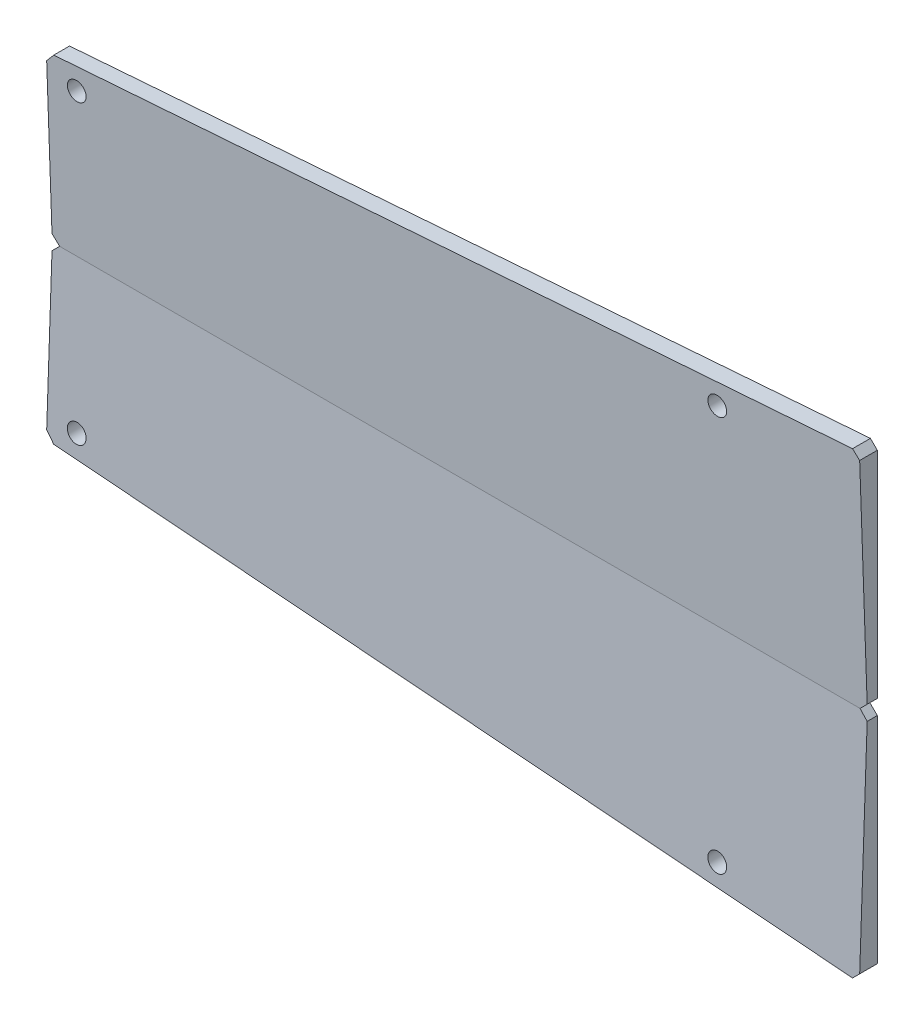
ISO-10303-21;
HEADER;
FILE_DESCRIPTION(('STEP AP214'),'2;1');
FILE_NAME('part.step','',(''),(''),'','','');
FILE_SCHEMA(('AUTOMOTIVE_DESIGN { 1 0 10303 214 1 1 1 1 }'));
ENDSEC;
DATA;
#1=APPLICATION_CONTEXT('core data for automotive mechanical design processes');
#2=APPLICATION_PROTOCOL_DEFINITION('international standard','automotive_design',2000,#1);
#3=PRODUCT_CONTEXT('',#1,'mechanical');
#4=PRODUCT('Part','Part','',(#3));
#5=PRODUCT_RELATED_PRODUCT_CATEGORY('part','',(#4));
#6=PRODUCT_DEFINITION_FORMATION('','',#4);
#7=PRODUCT_DEFINITION_CONTEXT('part definition',#1,'design');
#8=PRODUCT_DEFINITION('design','',#6,#7);
#9=PRODUCT_DEFINITION_SHAPE('','',#8);
#10=(LENGTH_UNIT() NAMED_UNIT(*) SI_UNIT(.MILLI.,.METRE.));
#11=(NAMED_UNIT(*) PLANE_ANGLE_UNIT() SI_UNIT($,.RADIAN.));
#12=(NAMED_UNIT(*) SI_UNIT($,.STERADIAN.) SOLID_ANGLE_UNIT());
#13=UNCERTAINTY_MEASURE_WITH_UNIT(LENGTH_MEASURE(1.E-05),#10,'distance_accuracy_value','');
#14=(GEOMETRIC_REPRESENTATION_CONTEXT(3) GLOBAL_UNCERTAINTY_ASSIGNED_CONTEXT((#13)) GLOBAL_UNIT_ASSIGNED_CONTEXT((#10,
#11,#12)) REPRESENTATION_CONTEXT('',''));
#15=CARTESIAN_POINT('',(0.,0.,0.));
#16=DIRECTION('',(0.,0.,1.));
#17=DIRECTION('',(1.,0.,0.));
#18=AXIS2_PLACEMENT_3D('',#15,#16,#17);
#19=CARTESIAN_POINT('',(-49.4388888888889,0.,2.));
#20=DIRECTION('',(0.,-0.034899496702501,0.999390827019096));
#21=DIRECTION('',(0.,-0.999390827019096,-0.034899496702501));
#22=AXIS2_PLACEMENT_3D('',#19,#20,#21);
#23=PLANE('',#22);
#24=CARTESIAN_POINT('',(86.5611111111111,40.,3.39683077966991));
#25=DIRECTION('',(0.,-0.034899496702501,0.999390827019096));
#26=DIRECTION('',(0.,-0.999390827019096,-0.034899496702501));
#27=AXIS2_PLACEMENT_3D('',#24,#25,#26);
#28=ELLIPSE('',#27,1.90115813416776,1.9);
#29=CARTESIAN_POINT('',(86.5611111111111,38.1,3.33048131763559));
#30=VERTEX_POINT('',#29);
#31=EDGE_CURVE('E204',#30,#30,#28,.T.);
#32=ORIENTED_EDGE('',*,*,#31,.F.);
#33=EDGE_LOOP('',(#32));
#34=FACE_BOUND('',#33,.T.);
#35=DIRECTION('',(-0.997139218587703,-0.0755408498930078,-0.00263794460632445));
#36=VECTOR('',#35,1.);
#37=CARTESIAN_POINT('',(115.556839829289,46.4996764180438,3.62380448163537));
#38=LINE('',#37,#36);
#39=CARTESIAN_POINT('',(114.166744913928,46.3943661971831,3.62012696768757));
#40=VERTEX_POINT('',#39);
#41=CARTESIAN_POINT('',(-47.943174856847,34.1133116690941,3.19126309339658));
#42=VERTEX_POINT('',#41);
#43=EDGE_CURVE('E216',#40,#42,#38,.T.);
#44=ORIENTED_EDGE('',*,*,#43,.T.);
#45=DIRECTION('',(0.651442242059262,0.758236052232911,0.0264781864003583));
#46=VECTOR('',#45,1.);
#47=CARTESIAN_POINT('',(-65.4486373408401,13.7381012369054,2.47974506654827));
#48=LINE('',#47,#46);
#49=CARTESIAN_POINT('',(-49.4388888888889,32.372398615406,3.13046906994357));
#50=VERTEX_POINT('',#49);
#51=EDGE_CURVE('E11',#42,#50,#48,.F.);
#52=ORIENTED_EDGE('',*,*,#51,.T.);
#53=DIRECTION('',(0.,-0.999390827019096,-0.034899496702501));
#54=VECTOR('',#53,1.);
#55=CARTESIAN_POINT('',(-49.4388888888889,33.958588854417,3.18586005365013));
#56=LINE('',#55,#54);
#57=CARTESIAN_POINT('',(-49.4388888888889,1.50000000000002,2.05238115423762));
#58=VERTEX_POINT('',#57);
#59=EDGE_CURVE('E211',#50,#58,#56,.T.);
#60=ORIENTED_EDGE('',*,*,#59,.T.);
#61=DIRECTION('',(-0.706891307583164,0.706891307583164,0.0246851884078319));
#62=VECTOR('',#61,1.);
#63=CARTESIAN_POINT('',(-48.6884318699938,0.74954298110496,2.02617461766732));
#64=LINE('',#63,#62);
#65=CARTESIAN_POINT('',(-47.9388888888889,0.,2.));
#66=VERTEX_POINT('',#65);
#67=EDGE_CURVE('E245',#58,#66,#64,.F.);
#68=ORIENTED_EDGE('',*,*,#67,.T.);
#69=DIRECTION('',(1.,0.,0.));
#70=VECTOR('',#69,1.);
#71=CARTESIAN_POINT('',(-49.4388888888889,0.,2.));
#72=LINE('',#71,#70);
#73=CARTESIAN_POINT('',(114.061111111111,0.,2.));
#74=VERTEX_POINT('',#73);
#75=EDGE_CURVE('E267',#66,#74,#72,.T.);
#76=ORIENTED_EDGE('',*,*,#75,.T.);
#77=DIRECTION('',(-0.706891307583167,-0.70689130758316,-0.0246851884078317));
#78=VECTOR('',#77,1.);
#79=CARTESIAN_POINT('',(32.3609261706706,-81.7001849404398,-0.853033325738264));
#80=LINE('',#79,#78);
#81=CARTESIAN_POINT('',(115.561111111111,1.49999999999995,2.05238115423762));
#82=VERTEX_POINT('',#81);
#83=EDGE_CURVE('E237',#74,#82,#80,.F.);
#84=ORIENTED_EDGE('',*,*,#83,.T.);
#85=DIRECTION('',(0.,0.999390827019096,0.034899496702501));
#86=VECTOR('',#85,1.);
#87=CARTESIAN_POINT('',(115.561111111111,0.,2.));
#88=LINE('',#87,#86);
#89=CARTESIAN_POINT('',(115.561111111111,45.,3.57143462712865));
#90=VERTEX_POINT('',#89);
#91=EDGE_CURVE('E215',#82,#90,#88,.T.);
#92=ORIENTED_EDGE('',*,*,#91,.T.);
#93=DIRECTION('',(0.706891307583164,-0.706891307583164,-0.0246851884078319));
#94=VECTOR('',#93,1.);
#95=CARTESIAN_POINT('',(55.6250937564178,104.936017354693,5.66444647342529));
#96=LINE('',#95,#94);
#97=EDGE_CURVE('E230',#90,#40,#96,.F.);
#98=ORIENTED_EDGE('',*,*,#97,.T.);
#99=EDGE_LOOP('',(#44,#52,#60,#68,#76,#84,#92,#98));
#100=FACE_BOUND('',#99,.T.);
#101=CARTESIAN_POINT('',(-43.4388888888889,30.,3.04762308475243));
#102=DIRECTION('',(0.,-0.034899496702501,0.999390827019096));
#103=DIRECTION('',(0.,-0.999390827019096,-0.034899496702501));
#104=AXIS2_PLACEMENT_3D('',#101,#102,#103);
#105=ELLIPSE('',#104,1.90115813416776,1.9);
#106=CARTESIAN_POINT('',(-43.4388888888889,28.1,2.98127362271811));
#107=VERTEX_POINT('',#106);
#108=EDGE_CURVE('E200',#107,#107,#105,.T.);
#109=ORIENTED_EDGE('',*,*,#108,.F.);
#110=EDGE_LOOP('',(#109));
#111=FACE_BOUND('',#110,.T.);
#112=ADVANCED_FACE('F34',(#34,#100,#111),#23,.T.);
#113=CARTESIAN_POINT('',(-49.4388888888889,0.,0.));
#114=DIRECTION('',(0.,0.,1.));
#115=DIRECTION('',(1.,0.,0.));
#116=AXIS2_PLACEMENT_3D('',#113,#114,#115);
#117=PLANE('',#116);
#118=CARTESIAN_POINT('',(86.5611111111111,40.,0.));
#119=DIRECTION('',(0.,0.,1.));
#120=DIRECTION('',(1.,0.,0.));
#121=AXIS2_PLACEMENT_3D('',#118,#119,#120);
#122=CIRCLE('',#121,1.9);
#123=CARTESIAN_POINT('',(88.4611111111111,40.,0.));
#124=VERTEX_POINT('',#123);
#125=EDGE_CURVE('E201',#124,#124,#122,.T.);
#126=ORIENTED_EDGE('',*,*,#125,.T.);
#127=EDGE_LOOP('',(#126));
#128=FACE_BOUND('',#127,.T.);
#129=DIRECTION('',(0.,-1.,0.));
#130=VECTOR('',#129,1.);
#131=CARTESIAN_POINT('',(-49.4388888888889,34.,0.));
#132=LINE('',#131,#130);
#133=CARTESIAN_POINT('',(-49.4388888888889,32.372398615406,0.));
#134=VERTEX_POINT('',#133);
#135=CARTESIAN_POINT('',(-49.4388888888889,1.50000000000002,0.));
#136=VERTEX_POINT('',#135);
#137=EDGE_CURVE('E205',#134,#136,#132,.T.);
#138=ORIENTED_EDGE('',*,*,#137,.F.);
#139=DIRECTION('',(-0.651670723445816,-0.758501989584475,0.));
#140=VECTOR('',#139,1.);
#141=CARTESIAN_POINT('',(-49.4388888888889,32.372398615406,0.));
#142=LINE('',#141,#140);
#143=CARTESIAN_POINT('',(-47.943174856847,34.1133116690941,0.));
#144=VERTEX_POINT('',#143);
#145=EDGE_CURVE('E56',#134,#144,#142,.F.);
#146=ORIENTED_EDGE('',*,*,#145,.T.);
#147=DIRECTION('',(-0.99714268802795,-0.0755411127293901,0.));
#148=VECTOR('',#147,1.);
#149=CARTESIAN_POINT('',(115.561111111111,46.5,0.));
#150=LINE('',#149,#148);
#151=CARTESIAN_POINT('',(114.166744913928,46.3943661971831,0.));
#152=VERTEX_POINT('',#151);
#153=EDGE_CURVE('E209',#152,#144,#150,.T.);
#154=ORIENTED_EDGE('',*,*,#153,.F.);
#155=DIRECTION('',(-0.707106781186548,0.707106781186548,0.));
#156=VECTOR('',#155,1.);
#157=CARTESIAN_POINT('',(114.166744913928,46.3943661971831,0.));
#158=LINE('',#157,#156);
#159=CARTESIAN_POINT('',(115.561111111111,45.,0.));
#160=VERTEX_POINT('',#159);
#161=EDGE_CURVE('E224',#152,#160,#158,.F.);
#162=ORIENTED_EDGE('',*,*,#161,.T.);
#163=DIRECTION('',(0.,1.,0.));
#164=VECTOR('',#163,1.);
#165=CARTESIAN_POINT('',(115.561111111111,0.,0.));
#166=LINE('',#165,#164);
#167=CARTESIAN_POINT('',(115.561111111111,1.49999999999999,0.));
#168=VERTEX_POINT('',#167);
#169=EDGE_CURVE('E207',#168,#160,#166,.T.);
#170=ORIENTED_EDGE('',*,*,#169,.F.);
#171=DIRECTION('',(0.707106781186551,0.707106781186544,0.));
#172=VECTOR('',#171,1.);
#173=CARTESIAN_POINT('',(115.561111111111,1.49999999999999,0.));
#174=LINE('',#173,#172);
#175=CARTESIAN_POINT('',(114.061111111111,0.,0.));
#176=VERTEX_POINT('',#175);
#177=EDGE_CURVE('E235',#168,#176,#174,.F.);
#178=ORIENTED_EDGE('',*,*,#177,.T.);
#179=DIRECTION('',(0.707106781186551,-0.707106781186544,0.));
#180=VECTOR('',#179,1.);
#181=CARTESIAN_POINT('',(115.561111111111,-1.49999999999999,0.));
#182=LINE('',#181,#180);
#183=CARTESIAN_POINT('',(115.561111111111,-1.49999999999999,0.));
#184=VERTEX_POINT('',#183);
#185=EDGE_CURVE('E169',#184,#176,#182,.F.);
#186=ORIENTED_EDGE('',*,*,#185,.F.);
#187=DIRECTION('',(0.,-1.,0.));
#188=VECTOR('',#187,1.);
#189=CARTESIAN_POINT('',(115.561111111111,0.,0.));
#190=LINE('',#189,#188);
#191=CARTESIAN_POINT('',(115.561111111111,-45.,0.));
#192=VERTEX_POINT('',#191);
#193=EDGE_CURVE('E155',#184,#192,#190,.T.);
#194=ORIENTED_EDGE('',*,*,#193,.T.);
#195=DIRECTION('',(-0.707106781186548,-0.707106781186548,0.));
#196=VECTOR('',#195,1.);
#197=CARTESIAN_POINT('',(114.166744913928,-46.3943661971831,0.));
#198=LINE('',#197,#196);
#199=CARTESIAN_POINT('',(114.166744913928,-46.3943661971831,0.));
#200=VERTEX_POINT('',#199);
#201=EDGE_CURVE('E139',#200,#192,#198,.F.);
#202=ORIENTED_EDGE('',*,*,#201,.F.);
#203=DIRECTION('',(-0.99714268802795,0.0755411127293901,0.));
#204=VECTOR('',#203,1.);
#205=CARTESIAN_POINT('',(115.561111111111,-46.5,0.));
#206=LINE('',#205,#204);
#207=CARTESIAN_POINT('',(-47.943174856847,-34.1133116690941,0.));
#208=VERTEX_POINT('',#207);
#209=EDGE_CURVE('E149',#200,#208,#206,.T.);
#210=ORIENTED_EDGE('',*,*,#209,.T.);
#211=DIRECTION('',(-0.651670723445816,0.758501989584475,0.));
#212=VECTOR('',#211,1.);
#213=CARTESIAN_POINT('',(-49.4388888888889,-32.372398615406,0.));
#214=LINE('',#213,#212);
#215=CARTESIAN_POINT('',(-49.4388888888889,-32.372398615406,0.));
#216=VERTEX_POINT('',#215);
#217=EDGE_CURVE('E191',#216,#208,#214,.F.);
#218=ORIENTED_EDGE('',*,*,#217,.F.);
#219=DIRECTION('',(0.,1.,0.));
#220=VECTOR('',#219,1.);
#221=CARTESIAN_POINT('',(-49.4388888888889,-34.,0.));
#222=LINE('',#221,#220);
#223=CARTESIAN_POINT('',(-49.4388888888889,-1.50000000000002,0.));
#224=VERTEX_POINT('',#223);
#225=EDGE_CURVE('E316',#216,#224,#222,.T.);
#226=ORIENTED_EDGE('',*,*,#225,.T.);
#227=DIRECTION('',(0.707106781186548,0.707106781186548,0.));
#228=VECTOR('',#227,1.);
#229=CARTESIAN_POINT('',(-47.9388888888889,0.,0.));
#230=LINE('',#229,#228);
#231=CARTESIAN_POINT('',(-47.9388888888889,0.,0.));
#232=VERTEX_POINT('',#231);
#233=EDGE_CURVE('E181',#232,#224,#230,.F.);
#234=ORIENTED_EDGE('',*,*,#233,.F.);
#235=DIRECTION('',(0.707106781186548,-0.707106781186548,0.));
#236=VECTOR('',#235,1.);
#237=CARTESIAN_POINT('',(-47.9388888888889,0.,0.));
#238=LINE('',#237,#236);
#239=EDGE_CURVE('E239',#232,#136,#238,.F.);
#240=ORIENTED_EDGE('',*,*,#239,.T.);
#241=EDGE_LOOP('',(#138,#146,#154,#162,#170,#178,#186,#194,#202,#210,#218,#226,#234,#240));
#242=FACE_BOUND('',#241,.T.);
#243=CARTESIAN_POINT('',(-43.4388888888889,30.,0.));
#244=DIRECTION('',(0.,0.,1.));
#245=DIRECTION('',(1.,0.,0.));
#246=AXIS2_PLACEMENT_3D('',#243,#244,#245);
#247=CIRCLE('',#246,1.9);
#248=CARTESIAN_POINT('',(-41.5388888888889,30.,0.));
#249=VERTEX_POINT('',#248);
#250=EDGE_CURVE('E197',#249,#249,#247,.T.);
#251=ORIENTED_EDGE('',*,*,#250,.T.);
#252=EDGE_LOOP('',(#251));
#253=FACE_BOUND('',#252,.T.);
#254=CARTESIAN_POINT('',(86.5611111111111,-40.,0.));
#255=DIRECTION('',(0.,0.,-1.));
#256=DIRECTION('',(1.,0.,0.));
#257=AXIS2_PLACEMENT_3D('',#254,#255,#256);
#258=CIRCLE('',#257,1.9);
#259=CARTESIAN_POINT('',(88.4611111111111,-40.,0.));
#260=VERTEX_POINT('',#259);
#261=EDGE_CURVE('E324',#260,#260,#258,.T.);
#262=ORIENTED_EDGE('',*,*,#261,.F.);
#263=EDGE_LOOP('',(#262));
#264=FACE_BOUND('',#263,.T.);
#265=CARTESIAN_POINT('',(-43.4388888888889,-30.,0.));
#266=DIRECTION('',(0.,0.,-1.));
#267=DIRECTION('',(1.,0.,0.));
#268=AXIS2_PLACEMENT_3D('',#265,#266,#267);
#269=CIRCLE('',#268,1.9);
#270=CARTESIAN_POINT('',(-41.5388888888889,-30.,0.));
#271=VERTEX_POINT('',#270);
#272=EDGE_CURVE('E331',#271,#271,#269,.T.);
#273=ORIENTED_EDGE('',*,*,#272,.F.);
#274=EDGE_LOOP('',(#273));
#275=FACE_BOUND('',#274,.T.);
#276=ADVANCED_FACE('F157',(#128,#242,#253,#264,#275),#117,.F.);
#277=CARTESIAN_POINT('',(-49.4388888888889,34.,2.));
#278=DIRECTION('',(1.,0.,0.));
#279=DIRECTION('',(0.,1.,0.));
#280=AXIS2_PLACEMENT_3D('',#277,#278,#279);
#281=PLANE('',#280);
#282=ORIENTED_EDGE('',*,*,#59,.F.);
#283=DIRECTION('',(0.,0.,-1.));
#284=VECTOR('',#283,1.);
#285=CARTESIAN_POINT('',(-49.4388888888889,32.372398615406,2.));
#286=LINE('',#285,#284);
#287=EDGE_CURVE('E247',#50,#134,#286,.T.);
#288=ORIENTED_EDGE('',*,*,#287,.T.);
#289=ORIENTED_EDGE('',*,*,#137,.T.);
#290=DIRECTION('',(0.,0.,1.));
#291=VECTOR('',#290,1.);
#292=CARTESIAN_POINT('',(-49.4388888888889,1.50000000000002,2.));
#293=LINE('',#292,#291);
#294=EDGE_CURVE('E242',#136,#58,#293,.T.);
#295=ORIENTED_EDGE('',*,*,#294,.T.);
#296=EDGE_LOOP('',(#282,#288,#289,#295));
#297=FACE_BOUND('',#296,.T.);
#298=ADVANCED_FACE('F253',(#297),#281,.F.);
#299=CARTESIAN_POINT('',(115.561111111111,0.,2.));
#300=DIRECTION('',(-1.,0.,0.));
#301=DIRECTION('',(0.,0.,1.));
#302=AXIS2_PLACEMENT_3D('',#299,#300,#301);
#303=PLANE('',#302);
#304=ORIENTED_EDGE('',*,*,#91,.F.);
#305=DIRECTION('',(0.,0.,-1.));
#306=VECTOR('',#305,1.);
#307=CARTESIAN_POINT('',(115.561111111111,1.49999999999999,2.));
#308=LINE('',#307,#306);
#309=EDGE_CURVE('E232',#82,#168,#308,.T.);
#310=ORIENTED_EDGE('',*,*,#309,.T.);
#311=ORIENTED_EDGE('',*,*,#169,.T.);
#312=DIRECTION('',(0.,0.,1.));
#313=VECTOR('',#312,1.);
#314=CARTESIAN_POINT('',(115.561111111111,45.,2.));
#315=LINE('',#314,#313);
#316=EDGE_CURVE('E227',#160,#90,#315,.T.);
#317=ORIENTED_EDGE('',*,*,#316,.T.);
#318=EDGE_LOOP('',(#304,#310,#311,#317));
#319=FACE_BOUND('',#318,.T.);
#320=ADVANCED_FACE('F303',(#319),#303,.F.);
#321=CARTESIAN_POINT('',(115.561111111111,46.5,2.));
#322=DIRECTION('',(0.0755411127293901,-0.99714268802795,0.));
#323=DIRECTION('',(0.99714268802795,0.0755411127293901,0.));
#324=AXIS2_PLACEMENT_3D('',#321,#322,#323);
#325=PLANE('',#324);
#326=ORIENTED_EDGE('',*,*,#153,.T.);
#327=DIRECTION('',(0.,0.,1.));
#328=VECTOR('',#327,1.);
#329=CARTESIAN_POINT('',(-47.943174856847,34.1133116690941,2.));
#330=LINE('',#329,#328);
#331=EDGE_CURVE('E42',#144,#42,#330,.T.);
#332=ORIENTED_EDGE('',*,*,#331,.T.);
#333=ORIENTED_EDGE('',*,*,#43,.F.);
#334=DIRECTION('',(0.,0.,-1.));
#335=VECTOR('',#334,1.);
#336=CARTESIAN_POINT('',(114.166744913928,46.3943661971831,2.));
#337=LINE('',#336,#335);
#338=EDGE_CURVE('E218',#40,#152,#337,.T.);
#339=ORIENTED_EDGE('',*,*,#338,.T.);
#340=EDGE_LOOP('',(#326,#332,#333,#339));
#341=FACE_BOUND('',#340,.T.);
#342=ADVANCED_FACE('F308',(#341),#325,.F.);
#343=CARTESIAN_POINT('',(86.5611111111111,40.,2.));
#344=DIRECTION('',(0.,0.,-1.));
#345=DIRECTION('',(-1.,0.,0.));
#346=AXIS2_PLACEMENT_3D('',#343,#344,#345);
#347=CYLINDRICAL_SURFACE('',#346,1.9);
#348=ORIENTED_EDGE('',*,*,#31,.T.);
#349=EDGE_LOOP('',(#348));
#350=FACE_BOUND('',#349,.T.);
#351=ORIENTED_EDGE('',*,*,#125,.F.);
#352=EDGE_LOOP('',(#351));
#353=FACE_BOUND('',#352,.T.);
#354=ADVANCED_FACE('F373',(#350,#353),#347,.F.);
#355=CARTESIAN_POINT('',(-43.4388888888889,30.,2.));
#356=DIRECTION('',(0.,0.,-1.));
#357=DIRECTION('',(-1.,0.,0.));
#358=AXIS2_PLACEMENT_3D('',#355,#356,#357);
#359=CYLINDRICAL_SURFACE('',#358,1.9);
#360=ORIENTED_EDGE('',*,*,#108,.T.);
#361=EDGE_LOOP('',(#360));
#362=FACE_BOUND('',#361,.T.);
#363=ORIENTED_EDGE('',*,*,#250,.F.);
#364=EDGE_LOOP('',(#363));
#365=FACE_BOUND('',#364,.T.);
#366=ADVANCED_FACE('F293',(#362,#365),#359,.F.);
#367=CARTESIAN_POINT('',(114.166744913928,46.3943661971831,2.));
#368=DIRECTION('',(-0.707106781186548,-0.707106781186548,0.));
#369=DIRECTION('',(0.707106781186548,-0.707106781186548,0.));
#370=AXIS2_PLACEMENT_3D('',#367,#368,#369);
#371=PLANE('',#370);
#372=ORIENTED_EDGE('',*,*,#97,.F.);
#373=ORIENTED_EDGE('',*,*,#316,.F.);
#374=ORIENTED_EDGE('',*,*,#161,.F.);
#375=ORIENTED_EDGE('',*,*,#338,.F.);
#376=EDGE_LOOP('',(#372,#373,#374,#375));
#377=FACE_BOUND('',#376,.T.);
#378=ADVANCED_FACE('F290',(#377),#371,.F.);
#379=CARTESIAN_POINT('',(115.561111111111,1.49999999999999,2.));
#380=DIRECTION('',(-0.707106781186544,0.707106781186551,0.));
#381=DIRECTION('',(-0.707106781186551,-0.707106781186544,0.));
#382=AXIS2_PLACEMENT_3D('',#379,#380,#381);
#383=PLANE('',#382);
#384=ORIENTED_EDGE('',*,*,#83,.F.);
#385=DIRECTION('',(0.,0.,1.));
#386=VECTOR('',#385,1.);
#387=CARTESIAN_POINT('',(114.061111111111,0.,2.));
#388=LINE('',#387,#386);
#389=EDGE_CURVE('E172',#176,#74,#388,.T.);
#390=ORIENTED_EDGE('',*,*,#389,.F.);
#391=ORIENTED_EDGE('',*,*,#177,.F.);
#392=ORIENTED_EDGE('',*,*,#309,.F.);
#393=EDGE_LOOP('',(#384,#390,#391,#392));
#394=FACE_BOUND('',#393,.T.);
#395=ADVANCED_FACE('F277',(#394),#383,.F.);
#396=CARTESIAN_POINT('',(-47.9388888888889,0.,2.));
#397=DIRECTION('',(0.707106781186547,0.707106781186547,0.));
#398=DIRECTION('',(-0.707106781186548,0.707106781186548,0.));
#399=AXIS2_PLACEMENT_3D('',#396,#397,#398);
#400=PLANE('',#399);
#401=ORIENTED_EDGE('',*,*,#67,.F.);
#402=ORIENTED_EDGE('',*,*,#294,.F.);
#403=ORIENTED_EDGE('',*,*,#239,.F.);
#404=DIRECTION('',(0.,0.,-1.));
#405=VECTOR('',#404,1.);
#406=CARTESIAN_POINT('',(-47.9388888888889,0.,2.));
#407=LINE('',#406,#405);
#408=EDGE_CURVE('E178',#66,#232,#407,.T.);
#409=ORIENTED_EDGE('',*,*,#408,.F.);
#410=EDGE_LOOP('',(#401,#402,#403,#409));
#411=FACE_BOUND('',#410,.T.);
#412=ADVANCED_FACE('F262',(#411),#400,.F.);
#413=CARTESIAN_POINT('',(-49.4388888888889,32.372398615406,2.));
#414=DIRECTION('',(0.758501989584475,-0.651670723445816,0.));
#415=DIRECTION('',(0.651670723445816,0.758501989584475,0.));
#416=AXIS2_PLACEMENT_3D('',#413,#414,#415);
#417=PLANE('',#416);
#418=ORIENTED_EDGE('',*,*,#51,.F.);
#419=ORIENTED_EDGE('',*,*,#331,.F.);
#420=ORIENTED_EDGE('',*,*,#145,.F.);
#421=ORIENTED_EDGE('',*,*,#287,.F.);
#422=EDGE_LOOP('',(#418,#419,#420,#421));
#423=FACE_BOUND('',#422,.T.);
#424=ADVANCED_FACE('F36',(#423),#417,.F.);
#425=CARTESIAN_POINT('',(-49.4388888888889,0.,2.));
#426=DIRECTION('',(0.,0.034899496702501,0.999390827019096));
#427=DIRECTION('',(0.,0.999390827019096,-0.034899496702501));
#428=AXIS2_PLACEMENT_3D('',#425,#426,#427);
#429=PLANE('',#428);
#430=CARTESIAN_POINT('',(86.5611111111111,-40.,3.39683077966991));
#431=DIRECTION('',(0.,-0.034899496702501,-0.999390827019096));
#432=DIRECTION('',(0.,0.999390827019096,-0.034899496702501));
#433=AXIS2_PLACEMENT_3D('',#430,#431,#432);
#434=ELLIPSE('',#433,1.90115813416776,1.9);
#435=CARTESIAN_POINT('',(86.5611111111111,-38.1,3.33048131763559));
#436=VERTEX_POINT('',#435);
#437=EDGE_CURVE('E318',#436,#436,#434,.T.);
#438=ORIENTED_EDGE('',*,*,#437,.T.);
#439=EDGE_LOOP('',(#438));
#440=FACE_BOUND('',#439,.T.);
#441=DIRECTION('',(-0.997139218587703,0.0755408498930078,-0.00263794460632445));
#442=VECTOR('',#441,1.);
#443=CARTESIAN_POINT('',(115.556839829289,-46.4996764180438,3.62380448163537));
#444=LINE('',#443,#442);
#445=CARTESIAN_POINT('',(114.166744913928,-46.3943661971831,3.62012696768757));
#446=VERTEX_POINT('',#445);
#447=CARTESIAN_POINT('',(-47.943174856847,-34.1133116690941,3.19126309339658));
#448=VERTEX_POINT('',#447);
#449=EDGE_CURVE('E146',#446,#448,#444,.T.);
#450=ORIENTED_EDGE('',*,*,#449,.F.);
#451=DIRECTION('',(0.706891307583164,0.706891307583164,-0.0246851884078319));
#452=VECTOR('',#451,1.);
#453=CARTESIAN_POINT('',(55.6250937564178,-104.936017354693,5.66444647342529));
#454=LINE('',#453,#452);
#455=CARTESIAN_POINT('',(115.561111111111,-45.,3.57143462712865));
#456=VERTEX_POINT('',#455);
#457=EDGE_CURVE('E142',#456,#446,#454,.F.);
#458=ORIENTED_EDGE('',*,*,#457,.F.);
#459=DIRECTION('',(0.,-0.999390827019096,0.034899496702501));
#460=VECTOR('',#459,1.);
#461=CARTESIAN_POINT('',(115.561111111111,0.,2.));
#462=LINE('',#461,#460);
#463=CARTESIAN_POINT('',(115.561111111111,-1.49999999999995,2.05238115423762));
#464=VERTEX_POINT('',#463);
#465=EDGE_CURVE('E328',#464,#456,#462,.T.);
#466=ORIENTED_EDGE('',*,*,#465,.F.);
#467=DIRECTION('',(-0.706891307583167,0.70689130758316,-0.0246851884078317));
#468=VECTOR('',#467,1.);
#469=CARTESIAN_POINT('',(32.3609261706706,81.7001849404398,-0.853033325738264));
#470=LINE('',#469,#468);
#471=EDGE_CURVE('E175',#74,#464,#470,.F.);
#472=ORIENTED_EDGE('',*,*,#471,.F.);
#473=ORIENTED_EDGE('',*,*,#75,.F.);
#474=DIRECTION('',(-0.706891307583164,-0.706891307583164,0.0246851884078319));
#475=VECTOR('',#474,1.);
#476=CARTESIAN_POINT('',(-48.6884318699938,-0.74954298110496,2.02617461766732));
#477=LINE('',#476,#475);
#478=CARTESIAN_POINT('',(-49.4388888888889,-1.50000000000002,2.05238115423762));
#479=VERTEX_POINT('',#478);
#480=EDGE_CURVE('E186',#479,#66,#477,.F.);
#481=ORIENTED_EDGE('',*,*,#480,.F.);
#482=DIRECTION('',(0.,0.999390827019096,-0.034899496702501));
#483=VECTOR('',#482,1.);
#484=CARTESIAN_POINT('',(-49.4388888888889,-33.958588854417,3.18586005365013));
#485=LINE('',#484,#483);
#486=CARTESIAN_POINT('',(-49.4388888888889,-32.372398615406,3.13046906994357));
#487=VERTEX_POINT('',#486);
#488=EDGE_CURVE('E154',#487,#479,#485,.T.);
#489=ORIENTED_EDGE('',*,*,#488,.F.);
#490=DIRECTION('',(0.651442242059262,-0.758236052232911,0.0264781864003583));
#491=VECTOR('',#490,1.);
#492=CARTESIAN_POINT('',(-65.4486373408401,-13.7381012369054,2.47974506654827));
#493=LINE('',#492,#491);
#494=EDGE_CURVE('E194',#448,#487,#493,.F.);
#495=ORIENTED_EDGE('',*,*,#494,.F.);
#496=EDGE_LOOP('',(#450,#458,#466,#472,#473,#481,#489,#495));
#497=FACE_BOUND('',#496,.T.);
#498=CARTESIAN_POINT('',(-43.4388888888889,-30.,3.04762308475243));
#499=DIRECTION('',(0.,-0.034899496702501,-0.999390827019096));
#500=DIRECTION('',(0.,0.999390827019096,-0.034899496702501));
#501=AXIS2_PLACEMENT_3D('',#498,#499,#500);
#502=ELLIPSE('',#501,1.90115813416776,1.9);
#503=CARTESIAN_POINT('',(-43.4388888888889,-28.1,2.98127362271811));
#504=VERTEX_POINT('',#503);
#505=EDGE_CURVE('E329',#504,#504,#502,.T.);
#506=ORIENTED_EDGE('',*,*,#505,.T.);
#507=EDGE_LOOP('',(#506));
#508=FACE_BOUND('',#507,.T.);
#509=ADVANCED_FACE('F269',(#440,#497,#508),#429,.T.);
#510=CARTESIAN_POINT('',(-49.4388888888889,-34.,2.));
#511=DIRECTION('',(1.,0.,0.));
#512=DIRECTION('',(0.,-1.,0.));
#513=AXIS2_PLACEMENT_3D('',#510,#511,#512);
#514=PLANE('',#513);
#515=ORIENTED_EDGE('',*,*,#488,.T.);
#516=DIRECTION('',(0.,0.,1.));
#517=VECTOR('',#516,1.);
#518=CARTESIAN_POINT('',(-49.4388888888889,-1.50000000000002,2.));
#519=LINE('',#518,#517);
#520=EDGE_CURVE('E184',#224,#479,#519,.T.);
#521=ORIENTED_EDGE('',*,*,#520,.F.);
#522=ORIENTED_EDGE('',*,*,#225,.F.);
#523=DIRECTION('',(0.,0.,-1.));
#524=VECTOR('',#523,1.);
#525=CARTESIAN_POINT('',(-49.4388888888889,-32.372398615406,2.));
#526=LINE('',#525,#524);
#527=EDGE_CURVE('E189',#487,#216,#526,.T.);
#528=ORIENTED_EDGE('',*,*,#527,.F.);
#529=EDGE_LOOP('',(#515,#521,#522,#528));
#530=FACE_BOUND('',#529,.T.);
#531=ADVANCED_FACE('F274',(#530),#514,.F.);
#532=CARTESIAN_POINT('',(115.561111111111,0.,2.));
#533=DIRECTION('',(-1.,0.,0.));
#534=DIRECTION('',(0.,0.,1.));
#535=AXIS2_PLACEMENT_3D('',#532,#533,#534);
#536=PLANE('',#535);
#537=ORIENTED_EDGE('',*,*,#465,.T.);
#538=DIRECTION('',(0.,0.,1.));
#539=VECTOR('',#538,1.);
#540=CARTESIAN_POINT('',(115.561111111111,-45.,2.));
#541=LINE('',#540,#539);
#542=EDGE_CURVE('E161',#192,#456,#541,.T.);
#543=ORIENTED_EDGE('',*,*,#542,.F.);
#544=ORIENTED_EDGE('',*,*,#193,.F.);
#545=DIRECTION('',(0.,0.,-1.));
#546=VECTOR('',#545,1.);
#547=CARTESIAN_POINT('',(115.561111111111,-1.49999999999999,2.));
#548=LINE('',#547,#546);
#549=EDGE_CURVE('E167',#464,#184,#548,.T.);
#550=ORIENTED_EDGE('',*,*,#549,.F.);
#551=EDGE_LOOP('',(#537,#543,#544,#550));
#552=FACE_BOUND('',#551,.T.);
#553=ADVANCED_FACE('F315',(#552),#536,.F.);
#554=CARTESIAN_POINT('',(115.561111111111,-46.5,2.));
#555=DIRECTION('',(0.0755411127293901,0.99714268802795,0.));
#556=DIRECTION('',(0.99714268802795,-0.0755411127293901,0.));
#557=AXIS2_PLACEMENT_3D('',#554,#555,#556);
#558=PLANE('',#557);
#559=ORIENTED_EDGE('',*,*,#209,.F.);
#560=DIRECTION('',(0.,0.,-1.));
#561=VECTOR('',#560,1.);
#562=CARTESIAN_POINT('',(114.166744913928,-46.3943661971831,2.));
#563=LINE('',#562,#561);
#564=EDGE_CURVE('E135',#446,#200,#563,.T.);
#565=ORIENTED_EDGE('',*,*,#564,.F.);
#566=ORIENTED_EDGE('',*,*,#449,.T.);
#567=DIRECTION('',(0.,0.,1.));
#568=VECTOR('',#567,1.);
#569=CARTESIAN_POINT('',(-47.943174856847,-34.1133116690941,2.));
#570=LINE('',#569,#568);
#571=EDGE_CURVE('E151',#208,#448,#570,.T.);
#572=ORIENTED_EDGE('',*,*,#571,.F.);
#573=EDGE_LOOP('',(#559,#565,#566,#572));
#574=FACE_BOUND('',#573,.T.);
#575=ADVANCED_FACE('F150',(#574),#558,.F.);
#576=CARTESIAN_POINT('',(86.5611111111111,-40.,2.));
#577=DIRECTION('',(0.,0.,-1.));
#578=DIRECTION('',(-1.,0.,0.));
#579=AXIS2_PLACEMENT_3D('',#576,#577,#578);
#580=CYLINDRICAL_SURFACE('',#579,1.9);
#581=ORIENTED_EDGE('',*,*,#437,.F.);
#582=EDGE_LOOP('',(#581));
#583=FACE_BOUND('',#582,.T.);
#584=ORIENTED_EDGE('',*,*,#261,.T.);
#585=EDGE_LOOP('',(#584));
#586=FACE_BOUND('',#585,.T.);
#587=ADVANCED_FACE('F343',(#583,#586),#580,.F.);
#588=CARTESIAN_POINT('',(-43.4388888888889,-30.,2.));
#589=DIRECTION('',(0.,0.,-1.));
#590=DIRECTION('',(-1.,0.,0.));
#591=AXIS2_PLACEMENT_3D('',#588,#589,#590);
#592=CYLINDRICAL_SURFACE('',#591,1.9);
#593=ORIENTED_EDGE('',*,*,#505,.F.);
#594=EDGE_LOOP('',(#593));
#595=FACE_BOUND('',#594,.T.);
#596=ORIENTED_EDGE('',*,*,#272,.T.);
#597=EDGE_LOOP('',(#596));
#598=FACE_BOUND('',#597,.T.);
#599=ADVANCED_FACE('F340',(#595,#598),#592,.F.);
#600=CARTESIAN_POINT('',(114.166744913928,-46.3943661971831,2.));
#601=DIRECTION('',(-0.707106781186548,0.707106781186548,0.));
#602=DIRECTION('',(0.707106781186548,0.707106781186548,0.));
#603=AXIS2_PLACEMENT_3D('',#600,#601,#602);
#604=PLANE('',#603);
#605=ORIENTED_EDGE('',*,*,#457,.T.);
#606=ORIENTED_EDGE('',*,*,#564,.T.);
#607=ORIENTED_EDGE('',*,*,#201,.T.);
#608=ORIENTED_EDGE('',*,*,#542,.T.);
#609=EDGE_LOOP('',(#605,#606,#607,#608));
#610=FACE_BOUND('',#609,.T.);
#611=ADVANCED_FACE('F137',(#610),#604,.F.);
#612=CARTESIAN_POINT('',(115.561111111111,-1.49999999999999,2.));
#613=DIRECTION('',(-0.707106781186544,-0.707106781186551,0.));
#614=DIRECTION('',(-0.707106781186551,0.707106781186544,0.));
#615=AXIS2_PLACEMENT_3D('',#612,#613,#614);
#616=PLANE('',#615);
#617=ORIENTED_EDGE('',*,*,#471,.T.);
#618=ORIENTED_EDGE('',*,*,#549,.T.);
#619=ORIENTED_EDGE('',*,*,#185,.T.);
#620=ORIENTED_EDGE('',*,*,#389,.T.);
#621=EDGE_LOOP('',(#617,#618,#619,#620));
#622=FACE_BOUND('',#621,.T.);
#623=ADVANCED_FACE('F310',(#622),#616,.F.);
#624=CARTESIAN_POINT('',(-47.9388888888889,0.,2.));
#625=DIRECTION('',(0.707106781186547,-0.707106781186547,0.));
#626=DIRECTION('',(-0.707106781186548,-0.707106781186548,0.));
#627=AXIS2_PLACEMENT_3D('',#624,#625,#626);
#628=PLANE('',#627);
#629=ORIENTED_EDGE('',*,*,#480,.T.);
#630=ORIENTED_EDGE('',*,*,#408,.T.);
#631=ORIENTED_EDGE('',*,*,#233,.T.);
#632=ORIENTED_EDGE('',*,*,#520,.T.);
#633=EDGE_LOOP('',(#629,#630,#631,#632));
#634=FACE_BOUND('',#633,.T.);
#635=ADVANCED_FACE('F363',(#634),#628,.F.);
#636=CARTESIAN_POINT('',(-49.4388888888889,-32.372398615406,2.));
#637=DIRECTION('',(0.758501989584475,0.651670723445816,0.));
#638=DIRECTION('',(0.651670723445816,-0.758501989584475,0.));
#639=AXIS2_PLACEMENT_3D('',#636,#637,#638);
#640=PLANE('',#639);
#641=ORIENTED_EDGE('',*,*,#494,.T.);
#642=ORIENTED_EDGE('',*,*,#527,.T.);
#643=ORIENTED_EDGE('',*,*,#217,.T.);
#644=ORIENTED_EDGE('',*,*,#571,.T.);
#645=EDGE_LOOP('',(#641,#642,#643,#644));
#646=FACE_BOUND('',#645,.T.);
#647=ADVANCED_FACE('F366',(#646),#640,.F.);
#648=CLOSED_SHELL('',(#112,#276,#298,#320,#342,#354,#366,#378,#395,#412,#424,#509,#531,#553,
#575,#587,#599,#611,#623,#635,#647));
#649=MANIFOLD_SOLID_BREP('B2',#648);
#650=ADVANCED_BREP_SHAPE_REPRESENTATION('',(#18,#649),#14);
#651=SHAPE_DEFINITION_REPRESENTATION(#9,#650);
ENDSEC;
END-ISO-10303-21;
